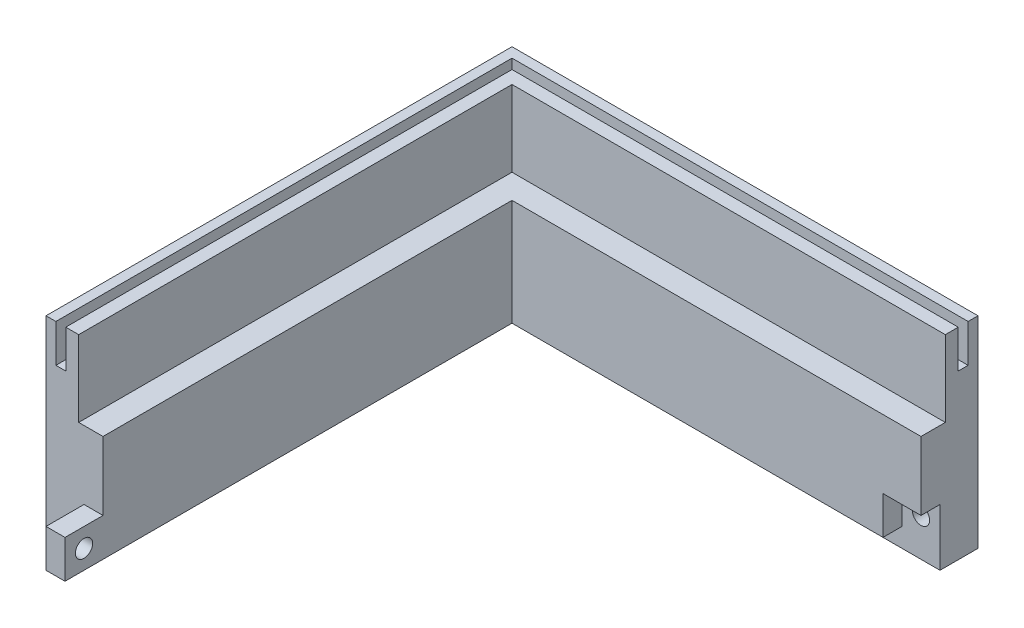
ISO-10303-21;
HEADER;
FILE_DESCRIPTION(('STEP AP214'),'2;1');
FILE_NAME('part.step','',(''),(''),'','','');
FILE_SCHEMA(('AUTOMOTIVE_DESIGN { 1 0 10303 214 1 1 1 1 }'));
ENDSEC;
DATA;
#1=APPLICATION_CONTEXT('core data for automotive mechanical design processes');
#2=APPLICATION_PROTOCOL_DEFINITION('international standard','automotive_design',2000,#1);
#3=PRODUCT_CONTEXT('',#1,'mechanical');
#4=PRODUCT('Part','Part','',(#3));
#5=PRODUCT_RELATED_PRODUCT_CATEGORY('part','',(#4));
#6=PRODUCT_DEFINITION_FORMATION('','',#4);
#7=PRODUCT_DEFINITION_CONTEXT('part definition',#1,'design');
#8=PRODUCT_DEFINITION('design','',#6,#7);
#9=PRODUCT_DEFINITION_SHAPE('','',#8);
#10=(LENGTH_UNIT() NAMED_UNIT(*) SI_UNIT(.MILLI.,.METRE.));
#11=(NAMED_UNIT(*) PLANE_ANGLE_UNIT() SI_UNIT($,.RADIAN.));
#12=(NAMED_UNIT(*) SI_UNIT($,.STERADIAN.) SOLID_ANGLE_UNIT());
#13=UNCERTAINTY_MEASURE_WITH_UNIT(LENGTH_MEASURE(1.E-05),#10,'distance_accuracy_value','');
#14=(GEOMETRIC_REPRESENTATION_CONTEXT(3) GLOBAL_UNCERTAINTY_ASSIGNED_CONTEXT((#13)) GLOBAL_UNIT_ASSIGNED_CONTEXT((#10,
#11,#12)) REPRESENTATION_CONTEXT('',''));
#15=CARTESIAN_POINT('',(0.,0.,0.));
#16=DIRECTION('',(0.,0.,1.));
#17=DIRECTION('',(1.,0.,0.));
#18=AXIS2_PLACEMENT_3D('',#15,#16,#17);
#19=CARTESIAN_POINT('',(0.,6.35,0.));
#20=DIRECTION('',(0.,-1.,0.));
#21=DIRECTION('',(0.,0.,-1.));
#22=AXIS2_PLACEMENT_3D('',#19,#20,#21);
#23=PLANE('',#22);
#24=CARTESIAN_POINT('',(-44.7306055991896,6.35,-21.7885049718995));
#25=DIRECTION('',(0.,-1.,0.));
#26=DIRECTION('',(0.,0.,-1.));
#27=AXIS2_PLACEMENT_3D('',#24,#25,#26);
#28=CIRCLE('',#27,2.8829);
#29=CARTESIAN_POINT('',(-44.7306055991896,6.35,-24.6714049718995));
#30=VERTEX_POINT('',#29);
#31=EDGE_CURVE('E497',#30,#30,#28,.T.);
#32=ORIENTED_EDGE('',*,*,#31,.F.);
#33=EDGE_LOOP('',(#32));
#34=FACE_BOUND('',#33,.T.);
#35=DIRECTION('',(1.,0.,0.));
#36=VECTOR('',#35,1.);
#37=CARTESIAN_POINT('',(-47.9056055991895,6.35,-24.9635049718995));
#38=LINE('',#37,#36);
#39=CARTESIAN_POINT('',(-47.9056055991895,6.35,-24.9635049718995));
#40=VERTEX_POINT('',#39);
#41=CARTESIAN_POINT('',(82.3963944008104,6.35,-24.9635049718995));
#42=VERTEX_POINT('',#41);
#43=EDGE_CURVE('E249',#40,#42,#38,.T.);
#44=ORIENTED_EDGE('',*,*,#43,.T.);
#45=DIRECTION('',(0.,0.,-1.));
#46=VECTOR('',#45,1.);
#47=CARTESIAN_POINT('',(82.3963944008104,6.35,-24.9635049718995));
#48=LINE('',#47,#46);
#49=CARTESIAN_POINT('',(82.3963944008104,6.35,-18.6135049718995));
#50=VERTEX_POINT('',#49);
#51=EDGE_CURVE('E201',#50,#42,#48,.T.);
#52=ORIENTED_EDGE('',*,*,#51,.F.);
#53=DIRECTION('',(-1.,0.,0.));
#54=VECTOR('',#53,1.);
#55=CARTESIAN_POINT('',(95.0963944008104,6.35,-18.6135049718995));
#56=LINE('',#55,#54);
#57=CARTESIAN_POINT('',(-41.5556055991896,6.35,-18.6135049718995));
#58=VERTEX_POINT('',#57);
#59=EDGE_CURVE('E251',#50,#58,#56,.T.);
#60=ORIENTED_EDGE('',*,*,#59,.T.);
#61=DIRECTION('',(0.,0.,1.));
#62=VECTOR('',#61,1.);
#63=CARTESIAN_POINT('',(-41.5556055991896,6.35,-18.6135049718995));
#64=LINE('',#63,#62);
#65=CARTESIAN_POINT('',(-41.5556055991896,6.35,130.738495028101));
#66=VERTEX_POINT('',#65);
#67=EDGE_CURVE('E243',#58,#66,#64,.T.);
#68=ORIENTED_EDGE('',*,*,#67,.T.);
#69=DIRECTION('',(1.,0.,0.));
#70=VECTOR('',#69,1.);
#71=CARTESIAN_POINT('',(-47.9056055991896,6.35,130.738495028101));
#72=LINE('',#71,#70);
#73=CARTESIAN_POINT('',(-47.9056055991896,6.35,130.738495028101));
#74=VERTEX_POINT('',#73);
#75=EDGE_CURVE('E223',#74,#66,#72,.T.);
#76=ORIENTED_EDGE('',*,*,#75,.F.);
#77=DIRECTION('',(0.,0.,-1.));
#78=VECTOR('',#77,1.);
#79=CARTESIAN_POINT('',(-47.9056055991896,6.35,130.738495028101));
#80=LINE('',#79,#78);
#81=CARTESIAN_POINT('',(-47.9056055991896,6.35,118.0384950281));
#82=VERTEX_POINT('',#81);
#83=EDGE_CURVE('E239',#74,#82,#80,.T.);
#84=ORIENTED_EDGE('',*,*,#83,.T.);
#85=DIRECTION('',(0.,0.,-1.));
#86=VECTOR('',#85,1.);
#87=CARTESIAN_POINT('',(-47.9056055991896,6.35,118.0384950281));
#88=LINE('',#87,#86);
#89=EDGE_CURVE('E245',#82,#40,#88,.T.);
#90=ORIENTED_EDGE('',*,*,#89,.T.);
#91=EDGE_LOOP('',(#44,#52,#60,#68,#76,#84,#90));
#92=FACE_BOUND('',#91,.T.);
#93=ADVANCED_FACE('F34',(#34,#92),#23,.T.);
#94=CARTESIAN_POINT('',(95.0963944008104,67.31,-18.6135049718995));
#95=DIRECTION('',(0.,0.,1.));
#96=DIRECTION('',(1.,0.,0.));
#97=AXIS2_PLACEMENT_3D('',#94,#95,#96);
#98=PLANE('',#97);
#99=DIRECTION('',(1.,0.,0.));
#100=VECTOR('',#99,1.);
#101=CARTESIAN_POINT('',(82.3963944008104,19.05,-18.6135049718995));
#102=LINE('',#101,#100);
#103=CARTESIAN_POINT('',(82.3963944008104,19.05,-18.6135049718995));
#104=VERTEX_POINT('',#103);
#105=CARTESIAN_POINT('',(95.0963944008104,19.05,-18.6135049718995));
#106=VERTEX_POINT('',#105);
#107=EDGE_CURVE('E200',#104,#106,#102,.T.);
#108=ORIENTED_EDGE('',*,*,#107,.T.);
#109=DIRECTION('',(0.,-1.,0.));
#110=VECTOR('',#109,1.);
#111=CARTESIAN_POINT('',(95.0963944008104,67.31,-18.6135049718995));
#112=LINE('',#111,#110);
#113=CARTESIAN_POINT('',(95.0963944008104,41.91,-18.6135049718995));
#114=VERTEX_POINT('',#113);
#115=EDGE_CURVE('E11',#114,#106,#112,.T.);
#116=ORIENTED_EDGE('',*,*,#115,.F.);
#117=DIRECTION('',(1.,0.,0.));
#118=VECTOR('',#117,1.);
#119=CARTESIAN_POINT('',(95.0963944008104,41.91,-18.6135049718995));
#120=LINE('',#119,#118);
#121=CARTESIAN_POINT('',(-41.5556055991896,41.91,-18.6135049718995));
#122=VERTEX_POINT('',#121);
#123=EDGE_CURVE('E267',#122,#114,#120,.T.);
#124=ORIENTED_EDGE('',*,*,#123,.F.);
#125=DIRECTION('',(0.,-1.,0.));
#126=VECTOR('',#125,1.);
#127=CARTESIAN_POINT('',(-41.5556055991896,67.31,-18.6135049718995));
#128=LINE('',#127,#126);
#129=EDGE_CURVE('E345',#122,#58,#128,.T.);
#130=ORIENTED_EDGE('',*,*,#129,.T.);
#131=ORIENTED_EDGE('',*,*,#59,.F.);
#132=DIRECTION('',(0.,-1.,0.));
#133=VECTOR('',#132,1.);
#134=CARTESIAN_POINT('',(82.3963944008104,6.35,-18.6135049718995));
#135=LINE('',#134,#133);
#136=EDGE_CURVE('E51',#104,#50,#135,.T.);
#137=ORIENTED_EDGE('',*,*,#136,.F.);
#138=EDGE_LOOP('',(#108,#116,#124,#130,#131,#137));
#139=FACE_BOUND('',#138,.T.);
#140=ADVANCED_FACE('F36',(#139),#98,.T.);
#141=CARTESIAN_POINT('',(-41.5556055991896,67.31,-18.6135049718995));
#142=DIRECTION('',(1.,0.,0.));
#143=DIRECTION('',(0.,0.,-1.));
#144=AXIS2_PLACEMENT_3D('',#141,#142,#143);
#145=PLANE('',#144);
#146=CARTESIAN_POINT('',(-41.5556055991896,12.7,124.388495028101));
#147=DIRECTION('',(1.,0.,0.));
#148=DIRECTION('',(0.,0.,-1.));
#149=AXIS2_PLACEMENT_3D('',#146,#147,#148);
#150=CIRCLE('',#149,2.88289999999999);
#151=CARTESIAN_POINT('',(-41.5556055991896,12.7,121.505595028101));
#152=VERTEX_POINT('',#151);
#153=EDGE_CURVE('E213',#152,#152,#150,.T.);
#154=ORIENTED_EDGE('',*,*,#153,.F.);
#155=EDGE_LOOP('',(#154));
#156=FACE_BOUND('',#155,.T.);
#157=DIRECTION('',(0.,-1.,0.));
#158=VECTOR('',#157,1.);
#159=CARTESIAN_POINT('',(-41.5556055991896,67.31,118.0384950281));
#160=LINE('',#159,#158);
#161=CARTESIAN_POINT('',(-41.5556055991896,41.91,118.0384950281));
#162=VERTEX_POINT('',#161);
#163=CARTESIAN_POINT('',(-41.5556055991896,19.05,118.0384950281));
#164=VERTEX_POINT('',#163);
#165=EDGE_CURVE('E362',#162,#164,#160,.T.);
#166=ORIENTED_EDGE('',*,*,#165,.T.);
#167=DIRECTION('',(0.,0.,-1.));
#168=VECTOR('',#167,1.);
#169=CARTESIAN_POINT('',(-41.5556055991896,19.05,130.738495028101));
#170=LINE('',#169,#168);
#171=CARTESIAN_POINT('',(-41.5556055991896,19.05,130.738495028101));
#172=VERTEX_POINT('',#171);
#173=EDGE_CURVE('E236',#172,#164,#170,.T.);
#174=ORIENTED_EDGE('',*,*,#173,.F.);
#175=DIRECTION('',(0.,1.,0.));
#176=VECTOR('',#175,1.);
#177=CARTESIAN_POINT('',(-41.5556055991896,6.35,130.738495028101));
#178=LINE('',#177,#176);
#179=EDGE_CURVE('E226',#66,#172,#178,.T.);
#180=ORIENTED_EDGE('',*,*,#179,.F.);
#181=ORIENTED_EDGE('',*,*,#67,.F.);
#182=ORIENTED_EDGE('',*,*,#129,.F.);
#183=DIRECTION('',(0.,0.,-1.));
#184=VECTOR('',#183,1.);
#185=CARTESIAN_POINT('',(-41.5556055991896,41.91,-18.6135049718995));
#186=LINE('',#185,#184);
#187=EDGE_CURVE('E264',#162,#122,#186,.T.);
#188=ORIENTED_EDGE('',*,*,#187,.F.);
#189=EDGE_LOOP('',(#166,#174,#180,#181,#182,#188));
#190=FACE_BOUND('',#189,.T.);
#191=ADVANCED_FACE('F372',(#156,#190),#145,.T.);
#192=CARTESIAN_POINT('',(0.,67.31,0.));
#193=DIRECTION('',(0.,1.,0.));
#194=DIRECTION('',(0.,0.,1.));
#195=AXIS2_PLACEMENT_3D('',#192,#193,#194);
#196=PLANE('',#195);
#197=DIRECTION('',(0.,0.,1.));
#198=VECTOR('',#197,1.);
#199=CARTESIAN_POINT('',(-57.3036055991896,67.31,118.0384950281));
#200=LINE('',#199,#198);
#201=CARTESIAN_POINT('',(-57.3036055991896,67.31,-34.3615049718995));
#202=VERTEX_POINT('',#201);
#203=CARTESIAN_POINT('',(-57.3036055991896,67.31,118.0384950281));
#204=VERTEX_POINT('',#203);
#205=EDGE_CURVE('E293',#202,#204,#200,.T.);
#206=ORIENTED_EDGE('',*,*,#205,.F.);
#207=DIRECTION('',(-1.,0.,0.));
#208=VECTOR('',#207,1.);
#209=CARTESIAN_POINT('',(-57.3036055991896,67.31,-34.3615049718995));
#210=LINE('',#209,#208);
#211=CARTESIAN_POINT('',(95.0963944008104,67.31,-34.3615049718995));
#212=VERTEX_POINT('',#211);
#213=EDGE_CURVE('E313',#212,#202,#210,.T.);
#214=ORIENTED_EDGE('',*,*,#213,.F.);
#215=DIRECTION('',(0.,0.,1.));
#216=VECTOR('',#215,1.);
#217=CARTESIAN_POINT('',(95.0963944008104,67.31,-37.6635049718995));
#218=LINE('',#217,#216);
#219=CARTESIAN_POINT('',(95.0963944008104,67.31,-37.6635049718995));
#220=VERTEX_POINT('',#219);
#221=EDGE_CURVE('E342',#220,#212,#218,.T.);
#222=ORIENTED_EDGE('',*,*,#221,.F.);
#223=DIRECTION('',(1.,0.,0.));
#224=VECTOR('',#223,1.);
#225=CARTESIAN_POINT('',(-60.6056055991896,67.31,-37.6635049718995));
#226=LINE('',#225,#224);
#227=CARTESIAN_POINT('',(-60.6056055991896,67.31,-37.6635049718995));
#228=VERTEX_POINT('',#227);
#229=EDGE_CURVE('E338',#228,#220,#226,.T.);
#230=ORIENTED_EDGE('',*,*,#229,.F.);
#231=DIRECTION('',(0.,0.,-1.));
#232=VECTOR('',#231,1.);
#233=CARTESIAN_POINT('',(-60.6056055991896,67.31,118.0384950281));
#234=LINE('',#233,#232);
#235=CARTESIAN_POINT('',(-60.6056055991896,67.31,118.0384950281));
#236=VERTEX_POINT('',#235);
#237=EDGE_CURVE('E334',#236,#228,#234,.T.);
#238=ORIENTED_EDGE('',*,*,#237,.F.);
#239=DIRECTION('',(-1.,0.,0.));
#240=VECTOR('',#239,1.);
#241=CARTESIAN_POINT('',(-41.5556055991896,67.31,118.0384950281));
#242=LINE('',#241,#240);
#243=EDGE_CURVE('E335',#204,#236,#242,.T.);
#244=ORIENTED_EDGE('',*,*,#243,.F.);
#245=EDGE_LOOP('',(#206,#214,#222,#230,#238,#244));
#246=FACE_BOUND('',#245,.T.);
#247=ADVANCED_FACE('F464',(#246),#196,.T.);
#248=CARTESIAN_POINT('',(95.0963944008104,67.31,-37.6635049718995));
#249=DIRECTION('',(1.,0.,0.));
#250=DIRECTION('',(0.,0.,-1.));
#251=AXIS2_PLACEMENT_3D('',#248,#249,#250);
#252=PLANE('',#251);
#253=DIRECTION('',(0.,0.,1.));
#254=VECTOR('',#253,1.);
#255=CARTESIAN_POINT('',(95.0963944008104,19.05,-24.9635049718995));
#256=LINE('',#255,#254);
#257=CARTESIAN_POINT('',(95.0963944008104,19.05,-24.9635049718995));
#258=VERTEX_POINT('',#257);
#259=EDGE_CURVE('E209',#258,#106,#256,.T.);
#260=ORIENTED_EDGE('',*,*,#259,.F.);
#261=DIRECTION('',(0.,-1.,0.));
#262=VECTOR('',#261,1.);
#263=CARTESIAN_POINT('',(95.0963944008104,6.35,-24.9635049718995));
#264=LINE('',#263,#262);
#265=CARTESIAN_POINT('',(95.0963944008104,0.,-24.9635049718995));
#266=VERTEX_POINT('',#265);
#267=EDGE_CURVE('E197',#258,#266,#264,.T.);
#268=ORIENTED_EDGE('',*,*,#267,.T.);
#269=DIRECTION('',(0.,0.,1.));
#270=VECTOR('',#269,1.);
#271=CARTESIAN_POINT('',(95.0963944008104,0.,-37.6635049718995));
#272=LINE('',#271,#270);
#273=CARTESIAN_POINT('',(95.0963944008104,0.,-37.6635049718995));
#274=VERTEX_POINT('',#273);
#275=EDGE_CURVE('E353',#274,#266,#272,.T.);
#276=ORIENTED_EDGE('',*,*,#275,.F.);
#277=DIRECTION('',(0.,-1.,0.));
#278=VECTOR('',#277,1.);
#279=CARTESIAN_POINT('',(95.0963944008104,67.31,-37.6635049718995));
#280=LINE('',#279,#278);
#281=EDGE_CURVE('E43',#220,#274,#280,.T.);
#282=ORIENTED_EDGE('',*,*,#281,.F.);
#283=ORIENTED_EDGE('',*,*,#221,.T.);
#284=DIRECTION('',(0.,1.,0.));
#285=VECTOR('',#284,1.);
#286=CARTESIAN_POINT('',(95.0963944008104,54.6166591658951,-34.3615049718995));
#287=LINE('',#286,#285);
#288=CARTESIAN_POINT('',(95.0963944008104,54.6166591658951,-34.3615049718995));
#289=VERTEX_POINT('',#288);
#290=EDGE_CURVE('E323',#289,#212,#287,.T.);
#291=ORIENTED_EDGE('',*,*,#290,.F.);
#292=DIRECTION('',(0.,0.,-1.));
#293=VECTOR('',#292,1.);
#294=CARTESIAN_POINT('',(95.0963944008104,54.6166591658951,-34.3615049718995));
#295=LINE('',#294,#293);
#296=CARTESIAN_POINT('',(95.0963944008104,54.6166591658951,-31.0595049718995));
#297=VERTEX_POINT('',#296);
#298=EDGE_CURVE('E299',#297,#289,#295,.T.);
#299=ORIENTED_EDGE('',*,*,#298,.F.);
#300=DIRECTION('',(0.,1.,0.));
#301=VECTOR('',#300,1.);
#302=CARTESIAN_POINT('',(95.0963944008104,54.6166591658951,-31.0595049718995));
#303=LINE('',#302,#301);
#304=CARTESIAN_POINT('',(95.0963944008104,67.31,-31.0595049718995));
#305=VERTEX_POINT('',#304);
#306=EDGE_CURVE('E325',#297,#305,#303,.T.);
#307=ORIENTED_EDGE('',*,*,#306,.T.);
#308=CARTESIAN_POINT('',(95.0963944008104,67.31,-26.7415049718995));
#309=VERTEX_POINT('',#308);
#310=EDGE_CURVE('E341',#305,#309,#218,.T.);
#311=ORIENTED_EDGE('',*,*,#310,.T.);
#312=DIRECTION('',(0.,1.,0.));
#313=VECTOR('',#312,1.);
#314=CARTESIAN_POINT('',(95.0963944008104,41.91,-26.7415049718995));
#315=LINE('',#314,#313);
#316=CARTESIAN_POINT('',(95.0963944008104,41.91,-26.7415049718995));
#317=VERTEX_POINT('',#316);
#318=EDGE_CURVE('E278',#317,#309,#315,.T.);
#319=ORIENTED_EDGE('',*,*,#318,.F.);
#320=DIRECTION('',(0.,0.,-1.));
#321=VECTOR('',#320,1.);
#322=CARTESIAN_POINT('',(95.0963944008104,41.91,-26.7415049718995));
#323=LINE('',#322,#321);
#324=EDGE_CURVE('E269',#114,#317,#323,.T.);
#325=ORIENTED_EDGE('',*,*,#324,.F.);
#326=ORIENTED_EDGE('',*,*,#115,.T.);
#327=EDGE_LOOP('',(#260,#268,#276,#282,#283,#291,#299,#307,#311,#319,#325,#326));
#328=FACE_BOUND('',#327,.T.);
#329=ADVANCED_FACE('F397',(#328),#252,.T.);
#330=CARTESIAN_POINT('',(-60.6056055991896,67.31,-37.6635049718995));
#331=DIRECTION('',(0.,0.,-1.));
#332=DIRECTION('',(-1.,0.,0.));
#333=AXIS2_PLACEMENT_3D('',#330,#331,#332);
#334=PLANE('',#333);
#335=DIRECTION('',(1.,0.,0.));
#336=VECTOR('',#335,1.);
#337=CARTESIAN_POINT('',(-60.6056055991896,0.,-37.6635049718995));
#338=LINE('',#337,#336);
#339=CARTESIAN_POINT('',(-60.6056055991896,0.,-37.6635049718995));
#340=VERTEX_POINT('',#339);
#341=EDGE_CURVE('E350',#340,#274,#338,.T.);
#342=ORIENTED_EDGE('',*,*,#341,.F.);
#343=DIRECTION('',(0.,-1.,0.));
#344=VECTOR('',#343,1.);
#345=CARTESIAN_POINT('',(-60.6056055991896,67.31,-37.6635049718995));
#346=LINE('',#345,#344);
#347=EDGE_CURVE('E357',#228,#340,#346,.T.);
#348=ORIENTED_EDGE('',*,*,#347,.F.);
#349=ORIENTED_EDGE('',*,*,#229,.T.);
#350=ORIENTED_EDGE('',*,*,#281,.T.);
#351=EDGE_LOOP('',(#342,#348,#349,#350));
#352=FACE_BOUND('',#351,.T.);
#353=ADVANCED_FACE('F469',(#352),#334,.T.);
#354=CARTESIAN_POINT('',(-60.6056055991896,67.31,118.0384950281));
#355=DIRECTION('',(-1.,0.,0.));
#356=DIRECTION('',(0.,0.,1.));
#357=AXIS2_PLACEMENT_3D('',#354,#355,#356);
#358=PLANE('',#357);
#359=DIRECTION('',(0.,0.,-1.));
#360=VECTOR('',#359,1.);
#361=CARTESIAN_POINT('',(-60.6056055991896,0.,118.0384950281));
#362=LINE('',#361,#360);
#363=CARTESIAN_POINT('',(-60.6056055991896,0.,118.0384950281));
#364=VERTEX_POINT('',#363);
#365=EDGE_CURVE('E347',#364,#340,#362,.T.);
#366=ORIENTED_EDGE('',*,*,#365,.F.);
#367=DIRECTION('',(0.,-1.,0.));
#368=VECTOR('',#367,1.);
#369=CARTESIAN_POINT('',(-60.6056055991896,67.31,118.0384950281));
#370=LINE('',#369,#368);
#371=EDGE_CURVE('E359',#236,#364,#370,.T.);
#372=ORIENTED_EDGE('',*,*,#371,.F.);
#373=ORIENTED_EDGE('',*,*,#237,.T.);
#374=ORIENTED_EDGE('',*,*,#347,.T.);
#375=EDGE_LOOP('',(#366,#372,#373,#374));
#376=FACE_BOUND('',#375,.T.);
#377=ADVANCED_FACE('F472',(#376),#358,.T.);
#378=CARTESIAN_POINT('',(-41.5556055991896,67.31,118.0384950281));
#379=DIRECTION('',(0.,0.,1.));
#380=DIRECTION('',(1.,0.,0.));
#381=AXIS2_PLACEMENT_3D('',#378,#379,#380);
#382=PLANE('',#381);
#383=DIRECTION('',(0.,-1.,0.));
#384=VECTOR('',#383,1.);
#385=CARTESIAN_POINT('',(-47.9056055991896,6.35,118.0384950281));
#386=LINE('',#385,#384);
#387=CARTESIAN_POINT('',(-47.9056055991896,19.05,118.0384950281));
#388=VERTEX_POINT('',#387);
#389=EDGE_CURVE('E218',#388,#82,#386,.T.);
#390=ORIENTED_EDGE('',*,*,#389,.F.);
#391=DIRECTION('',(-1.,0.,0.));
#392=VECTOR('',#391,1.);
#393=CARTESIAN_POINT('',(-47.9056055991896,19.05,118.0384950281));
#394=LINE('',#393,#392);
#395=EDGE_CURVE('E59',#164,#388,#394,.T.);
#396=ORIENTED_EDGE('',*,*,#395,.F.);
#397=ORIENTED_EDGE('',*,*,#165,.F.);
#398=DIRECTION('',(1.,0.,0.));
#399=VECTOR('',#398,1.);
#400=CARTESIAN_POINT('',(-41.5556055991896,41.91,118.0384950281));
#401=LINE('',#400,#399);
#402=CARTESIAN_POINT('',(-49.6836055991896,41.91,118.0384950281));
#403=VERTEX_POINT('',#402);
#404=EDGE_CURVE('E262',#403,#162,#401,.T.);
#405=ORIENTED_EDGE('',*,*,#404,.F.);
#406=DIRECTION('',(0.,1.,0.));
#407=VECTOR('',#406,1.);
#408=CARTESIAN_POINT('',(-49.6836055991896,41.91,118.0384950281));
#409=LINE('',#408,#407);
#410=CARTESIAN_POINT('',(-49.6836055991896,67.31,118.0384950281));
#411=VERTEX_POINT('',#410);
#412=EDGE_CURVE('E282',#403,#411,#409,.T.);
#413=ORIENTED_EDGE('',*,*,#412,.T.);
#414=CARTESIAN_POINT('',(-54.0016055991896,67.31,118.0384950281));
#415=VERTEX_POINT('',#414);
#416=EDGE_CURVE('E332',#411,#415,#242,.T.);
#417=ORIENTED_EDGE('',*,*,#416,.T.);
#418=DIRECTION('',(0.,1.,0.));
#419=VECTOR('',#418,1.);
#420=CARTESIAN_POINT('',(-54.0016055991896,54.6166591658951,118.038495028101));
#421=LINE('',#420,#419);
#422=CARTESIAN_POINT('',(-54.0016055991896,54.6166591658951,118.038495028101));
#423=VERTEX_POINT('',#422);
#424=EDGE_CURVE('E308',#423,#415,#421,.T.);
#425=ORIENTED_EDGE('',*,*,#424,.F.);
#426=DIRECTION('',(1.,0.,0.));
#427=VECTOR('',#426,1.);
#428=CARTESIAN_POINT('',(-57.3036055991896,54.6166591658951,118.0384950281));
#429=LINE('',#428,#427);
#430=CARTESIAN_POINT('',(-57.3036055991896,54.6166591658951,118.0384950281));
#431=VERTEX_POINT('',#430);
#432=EDGE_CURVE('E289',#431,#423,#429,.T.);
#433=ORIENTED_EDGE('',*,*,#432,.F.);
#434=DIRECTION('',(0.,1.,0.));
#435=VECTOR('',#434,1.);
#436=CARTESIAN_POINT('',(-57.3036055991896,54.6166591658951,118.0384950281));
#437=LINE('',#436,#435);
#438=EDGE_CURVE('E317',#431,#204,#437,.T.);
#439=ORIENTED_EDGE('',*,*,#438,.T.);
#440=ORIENTED_EDGE('',*,*,#243,.T.);
#441=ORIENTED_EDGE('',*,*,#371,.T.);
#442=DIRECTION('',(-1.,0.,0.));
#443=VECTOR('',#442,1.);
#444=CARTESIAN_POINT('',(-41.5556055991896,0.,118.0384950281));
#445=LINE('',#444,#443);
#446=CARTESIAN_POINT('',(-47.9056055991896,0.,118.0384950281));
#447=VERTEX_POINT('',#446);
#448=EDGE_CURVE('E320',#447,#364,#445,.T.);
#449=ORIENTED_EDGE('',*,*,#448,.F.);
#450=DIRECTION('',(0.,-1.,0.));
#451=VECTOR('',#450,1.);
#452=CARTESIAN_POINT('',(-47.9056055991896,6.35,118.0384950281));
#453=LINE('',#452,#451);
#454=EDGE_CURVE('E253',#82,#447,#453,.T.);
#455=ORIENTED_EDGE('',*,*,#454,.F.);
#456=EDGE_LOOP('',(#390,#396,#397,#405,#413,#417,#425,#433,#439,#440,#441,#449,#455));
#457=FACE_BOUND('',#456,.T.);
#458=ADVANCED_FACE('F389',(#457),#382,.T.);
#459=DIRECTION('',(0.,0.,1.));
#460=VECTOR('',#459,1.);
#461=CARTESIAN_POINT('',(-49.6836055991896,67.31,118.0384950281));
#462=LINE('',#461,#460);
#463=CARTESIAN_POINT('',(-49.6836055991896,67.31,-26.7415049718995));
#464=VERTEX_POINT('',#463);
#465=EDGE_CURVE('E265',#464,#411,#462,.T.);
#466=ORIENTED_EDGE('',*,*,#465,.F.);
#467=DIRECTION('',(-1.,0.,0.));
#468=VECTOR('',#467,1.);
#469=CARTESIAN_POINT('',(-49.6836055991896,67.31,-26.7415049718995));
#470=LINE('',#469,#468);
#471=EDGE_CURVE('E258',#309,#464,#470,.T.);
#472=ORIENTED_EDGE('',*,*,#471,.F.);
#473=ORIENTED_EDGE('',*,*,#310,.F.);
#474=DIRECTION('',(1.,0.,0.));
#475=VECTOR('',#474,1.);
#476=CARTESIAN_POINT('',(-54.0016055991896,67.31,-31.0595049718995));
#477=LINE('',#476,#475);
#478=CARTESIAN_POINT('',(-54.0016055991896,67.31,-31.0595049718995));
#479=VERTEX_POINT('',#478);
#480=EDGE_CURVE('E311',#479,#305,#477,.T.);
#481=ORIENTED_EDGE('',*,*,#480,.F.);
#482=DIRECTION('',(0.,0.,-1.));
#483=VECTOR('',#482,1.);
#484=CARTESIAN_POINT('',(-54.0016055991896,67.31,118.038495028101));
#485=LINE('',#484,#483);
#486=EDGE_CURVE('E285',#415,#479,#485,.T.);
#487=ORIENTED_EDGE('',*,*,#486,.F.);
#488=ORIENTED_EDGE('',*,*,#416,.F.);
#489=EDGE_LOOP('',(#466,#472,#473,#481,#487,#488));
#490=FACE_BOUND('',#489,.T.);
#491=ADVANCED_FACE('F460',(#490),#196,.T.);
#492=CARTESIAN_POINT('',(0.,0.,0.));
#493=DIRECTION('',(0.,1.,0.));
#494=DIRECTION('',(0.,0.,1.));
#495=AXIS2_PLACEMENT_3D('',#492,#493,#494);
#496=PLANE('',#495);
#497=ORIENTED_EDGE('',*,*,#275,.T.);
#498=DIRECTION('',(1.,0.,0.));
#499=VECTOR('',#498,1.);
#500=CARTESIAN_POINT('',(-47.9056055991895,0.,-24.9635049718995));
#501=LINE('',#500,#499);
#502=CARTESIAN_POINT('',(-47.9056055991895,0.,-24.9635049718995));
#503=VERTEX_POINT('',#502);
#504=EDGE_CURVE('E246',#503,#266,#501,.T.);
#505=ORIENTED_EDGE('',*,*,#504,.F.);
#506=DIRECTION('',(0.,0.,-1.));
#507=VECTOR('',#506,1.);
#508=CARTESIAN_POINT('',(-47.9056055991896,0.,118.0384950281));
#509=LINE('',#508,#507);
#510=EDGE_CURVE('E242',#447,#503,#509,.T.);
#511=ORIENTED_EDGE('',*,*,#510,.F.);
#512=ORIENTED_EDGE('',*,*,#448,.T.);
#513=ORIENTED_EDGE('',*,*,#365,.T.);
#514=ORIENTED_EDGE('',*,*,#341,.T.);
#515=EDGE_LOOP('',(#497,#505,#511,#512,#513,#514));
#516=FACE_BOUND('',#515,.T.);
#517=ADVANCED_FACE('F393',(#516),#496,.F.);
#518=CARTESIAN_POINT('',(-57.3036055991896,54.6166591658951,118.0384950281));
#519=DIRECTION('',(-1.,0.,0.));
#520=DIRECTION('',(0.,0.,1.));
#521=AXIS2_PLACEMENT_3D('',#518,#519,#520);
#522=PLANE('',#521);
#523=ORIENTED_EDGE('',*,*,#205,.T.);
#524=ORIENTED_EDGE('',*,*,#438,.F.);
#525=DIRECTION('',(0.,0.,1.));
#526=VECTOR('',#525,1.);
#527=CARTESIAN_POINT('',(-57.3036055991896,54.6166591658951,118.0384950281));
#528=LINE('',#527,#526);
#529=CARTESIAN_POINT('',(-57.3036055991896,54.6166591658951,-34.3615049718995));
#530=VERTEX_POINT('',#529);
#531=EDGE_CURVE('E305',#530,#431,#528,.T.);
#532=ORIENTED_EDGE('',*,*,#531,.F.);
#533=DIRECTION('',(0.,1.,0.));
#534=VECTOR('',#533,1.);
#535=CARTESIAN_POINT('',(-57.3036055991896,54.6166591658951,-34.3615049718995));
#536=LINE('',#535,#534);
#537=EDGE_CURVE('E321',#530,#202,#536,.T.);
#538=ORIENTED_EDGE('',*,*,#537,.T.);
#539=EDGE_LOOP('',(#523,#524,#532,#538));
#540=FACE_BOUND('',#539,.T.);
#541=ADVANCED_FACE('F445',(#540),#522,.F.);
#542=CARTESIAN_POINT('',(-57.3036055991896,54.6166591658951,-34.3615049718995));
#543=DIRECTION('',(0.,0.,-1.));
#544=DIRECTION('',(-1.,0.,0.));
#545=AXIS2_PLACEMENT_3D('',#542,#543,#544);
#546=PLANE('',#545);
#547=ORIENTED_EDGE('',*,*,#213,.T.);
#548=ORIENTED_EDGE('',*,*,#537,.F.);
#549=DIRECTION('',(-1.,0.,0.));
#550=VECTOR('',#549,1.);
#551=CARTESIAN_POINT('',(-57.3036055991896,54.6166591658951,-34.3615049718995));
#552=LINE('',#551,#550);
#553=EDGE_CURVE('E302',#289,#530,#552,.T.);
#554=ORIENTED_EDGE('',*,*,#553,.F.);
#555=ORIENTED_EDGE('',*,*,#290,.T.);
#556=EDGE_LOOP('',(#547,#548,#554,#555));
#557=FACE_BOUND('',#556,.T.);
#558=ADVANCED_FACE('F448',(#557),#546,.F.);
#559=CARTESIAN_POINT('',(-54.0016055991896,54.6166591658951,-31.0595049718995));
#560=DIRECTION('',(0.,0.,1.));
#561=DIRECTION('',(1.,0.,0.));
#562=AXIS2_PLACEMENT_3D('',#559,#560,#561);
#563=PLANE('',#562);
#564=ORIENTED_EDGE('',*,*,#480,.T.);
#565=ORIENTED_EDGE('',*,*,#306,.F.);
#566=DIRECTION('',(1.,0.,0.));
#567=VECTOR('',#566,1.);
#568=CARTESIAN_POINT('',(-54.0016055991896,54.6166591658951,-31.0595049718995));
#569=LINE('',#568,#567);
#570=CARTESIAN_POINT('',(-54.0016055991896,54.6166591658951,-31.0595049718995));
#571=VERTEX_POINT('',#570);
#572=EDGE_CURVE('E296',#571,#297,#569,.T.);
#573=ORIENTED_EDGE('',*,*,#572,.F.);
#574=DIRECTION('',(0.,1.,0.));
#575=VECTOR('',#574,1.);
#576=CARTESIAN_POINT('',(-54.0016055991896,54.6166591658951,-31.0595049718995));
#577=LINE('',#576,#575);
#578=EDGE_CURVE('E328',#571,#479,#577,.T.);
#579=ORIENTED_EDGE('',*,*,#578,.T.);
#580=EDGE_LOOP('',(#564,#565,#573,#579));
#581=FACE_BOUND('',#580,.T.);
#582=ADVANCED_FACE('F452',(#581),#563,.F.);
#583=CARTESIAN_POINT('',(-54.0016055991896,54.6166591658951,118.038495028101));
#584=DIRECTION('',(1.,0.,0.));
#585=DIRECTION('',(0.,0.,-1.));
#586=AXIS2_PLACEMENT_3D('',#583,#584,#585);
#587=PLANE('',#586);
#588=ORIENTED_EDGE('',*,*,#486,.T.);
#589=ORIENTED_EDGE('',*,*,#578,.F.);
#590=DIRECTION('',(0.,0.,-1.));
#591=VECTOR('',#590,1.);
#592=CARTESIAN_POINT('',(-54.0016055991896,54.6166591658951,118.038495028101));
#593=LINE('',#592,#591);
#594=EDGE_CURVE('E292',#423,#571,#593,.T.);
#595=ORIENTED_EDGE('',*,*,#594,.F.);
#596=ORIENTED_EDGE('',*,*,#424,.T.);
#597=EDGE_LOOP('',(#588,#589,#595,#596));
#598=FACE_BOUND('',#597,.T.);
#599=ADVANCED_FACE('F443',(#598),#587,.F.);
#600=CARTESIAN_POINT('',(0.,54.6166591658951,0.));
#601=DIRECTION('',(0.,1.,0.));
#602=DIRECTION('',(0.,0.,1.));
#603=AXIS2_PLACEMENT_3D('',#600,#601,#602);
#604=PLANE('',#603);
#605=ORIENTED_EDGE('',*,*,#432,.T.);
#606=ORIENTED_EDGE('',*,*,#594,.T.);
#607=ORIENTED_EDGE('',*,*,#572,.T.);
#608=ORIENTED_EDGE('',*,*,#298,.T.);
#609=ORIENTED_EDGE('',*,*,#553,.T.);
#610=ORIENTED_EDGE('',*,*,#531,.T.);
#611=EDGE_LOOP('',(#605,#606,#607,#608,#609,#610));
#612=FACE_BOUND('',#611,.T.);
#613=ADVANCED_FACE('F436',(#612),#604,.T.);
#614=CARTESIAN_POINT('',(-49.6836055991896,41.91,118.0384950281));
#615=DIRECTION('',(-1.,0.,0.));
#616=DIRECTION('',(0.,0.,1.));
#617=AXIS2_PLACEMENT_3D('',#614,#615,#616);
#618=PLANE('',#617);
#619=ORIENTED_EDGE('',*,*,#465,.T.);
#620=ORIENTED_EDGE('',*,*,#412,.F.);
#621=DIRECTION('',(0.,0.,1.));
#622=VECTOR('',#621,1.);
#623=CARTESIAN_POINT('',(-49.6836055991896,41.91,118.0384950281));
#624=LINE('',#623,#622);
#625=CARTESIAN_POINT('',(-49.6836055991896,41.91,-26.7415049718995));
#626=VERTEX_POINT('',#625);
#627=EDGE_CURVE('E275',#626,#403,#624,.T.);
#628=ORIENTED_EDGE('',*,*,#627,.F.);
#629=DIRECTION('',(0.,1.,0.));
#630=VECTOR('',#629,1.);
#631=CARTESIAN_POINT('',(-49.6836055991896,41.91,-26.7415049718995));
#632=LINE('',#631,#630);
#633=EDGE_CURVE('E286',#626,#464,#632,.T.);
#634=ORIENTED_EDGE('',*,*,#633,.T.);
#635=EDGE_LOOP('',(#619,#620,#628,#634));
#636=FACE_BOUND('',#635,.T.);
#637=ADVANCED_FACE('F433',(#636),#618,.F.);
#638=CARTESIAN_POINT('',(-49.6836055991896,41.91,-26.7415049718995));
#639=DIRECTION('',(0.,0.,-1.));
#640=DIRECTION('',(-1.,0.,0.));
#641=AXIS2_PLACEMENT_3D('',#638,#639,#640);
#642=PLANE('',#641);
#643=ORIENTED_EDGE('',*,*,#471,.T.);
#644=ORIENTED_EDGE('',*,*,#633,.F.);
#645=DIRECTION('',(-1.,0.,0.));
#646=VECTOR('',#645,1.);
#647=CARTESIAN_POINT('',(-49.6836055991896,41.91,-26.7415049718995));
#648=LINE('',#647,#646);
#649=EDGE_CURVE('E272',#317,#626,#648,.T.);
#650=ORIENTED_EDGE('',*,*,#649,.F.);
#651=ORIENTED_EDGE('',*,*,#318,.T.);
#652=EDGE_LOOP('',(#643,#644,#650,#651));
#653=FACE_BOUND('',#652,.T.);
#654=ADVANCED_FACE('F432',(#653),#642,.F.);
#655=CARTESIAN_POINT('',(0.,41.91,0.));
#656=DIRECTION('',(0.,-1.,0.));
#657=DIRECTION('',(0.,0.,-1.));
#658=AXIS2_PLACEMENT_3D('',#655,#656,#657);
#659=PLANE('',#658);
#660=ORIENTED_EDGE('',*,*,#404,.T.);
#661=ORIENTED_EDGE('',*,*,#187,.T.);
#662=ORIENTED_EDGE('',*,*,#123,.T.);
#663=ORIENTED_EDGE('',*,*,#324,.T.);
#664=ORIENTED_EDGE('',*,*,#649,.T.);
#665=ORIENTED_EDGE('',*,*,#627,.T.);
#666=EDGE_LOOP('',(#660,#661,#662,#663,#664,#665));
#667=FACE_BOUND('',#666,.T.);
#668=ADVANCED_FACE('F402',(#667),#659,.F.);
#669=CARTESIAN_POINT('',(-47.9056055991895,6.35,-24.9635049718995));
#670=DIRECTION('',(0.,0.,-1.));
#671=DIRECTION('',(-1.,0.,0.));
#672=AXIS2_PLACEMENT_3D('',#669,#670,#671);
#673=PLANE('',#672);
#674=CARTESIAN_POINT('',(88.7463944008104,12.7,-24.9635049718995));
#675=DIRECTION('',(0.,0.,1.));
#676=DIRECTION('',(1.,0.,0.));
#677=AXIS2_PLACEMENT_3D('',#674,#675,#676);
#678=CIRCLE('',#677,2.88289999999999);
#679=CARTESIAN_POINT('',(91.6292944008104,12.7,-24.9635049718995));
#680=VERTEX_POINT('',#679);
#681=EDGE_CURVE('E490',#680,#680,#678,.T.);
#682=ORIENTED_EDGE('',*,*,#681,.F.);
#683=EDGE_LOOP('',(#682));
#684=FACE_BOUND('',#683,.T.);
#685=ORIENTED_EDGE('',*,*,#504,.T.);
#686=ORIENTED_EDGE('',*,*,#267,.F.);
#687=DIRECTION('',(1.,0.,0.));
#688=VECTOR('',#687,1.);
#689=CARTESIAN_POINT('',(82.3963944008104,19.05,-24.9635049718995));
#690=LINE('',#689,#688);
#691=CARTESIAN_POINT('',(82.3963944008104,19.05,-24.9635049718995));
#692=VERTEX_POINT('',#691);
#693=EDGE_CURVE('E190',#692,#258,#690,.T.);
#694=ORIENTED_EDGE('',*,*,#693,.F.);
#695=DIRECTION('',(0.,1.,0.));
#696=VECTOR('',#695,1.);
#697=CARTESIAN_POINT('',(82.3963944008104,6.35,-24.9635049718995));
#698=LINE('',#697,#696);
#699=EDGE_CURVE('E195',#42,#692,#698,.T.);
#700=ORIENTED_EDGE('',*,*,#699,.F.);
#701=ORIENTED_EDGE('',*,*,#43,.F.);
#702=DIRECTION('',(0.,-1.,0.));
#703=VECTOR('',#702,1.);
#704=CARTESIAN_POINT('',(-47.9056055991895,6.35,-24.9635049718995));
#705=LINE('',#704,#703);
#706=EDGE_CURVE('E259',#40,#503,#705,.T.);
#707=ORIENTED_EDGE('',*,*,#706,.T.);
#708=EDGE_LOOP('',(#685,#686,#694,#700,#701,#707));
#709=FACE_BOUND('',#708,.T.);
#710=ADVANCED_FACE('F192',(#684,#709),#673,.F.);
#711=CARTESIAN_POINT('',(-47.9056055991896,6.35,118.0384950281));
#712=DIRECTION('',(-1.,0.,0.));
#713=DIRECTION('',(0.,0.,1.));
#714=AXIS2_PLACEMENT_3D('',#711,#712,#713);
#715=PLANE('',#714);
#716=ORIENTED_EDGE('',*,*,#510,.T.);
#717=ORIENTED_EDGE('',*,*,#706,.F.);
#718=ORIENTED_EDGE('',*,*,#89,.F.);
#719=ORIENTED_EDGE('',*,*,#454,.T.);
#720=EDGE_LOOP('',(#716,#717,#718,#719));
#721=FACE_BOUND('',#720,.T.);
#722=ADVANCED_FACE('F386',(#721),#715,.F.);
#723=CARTESIAN_POINT('',(-47.9056055991896,6.35,130.738495028101));
#724=DIRECTION('',(1.,0.,0.));
#725=DIRECTION('',(0.,0.,-1.));
#726=AXIS2_PLACEMENT_3D('',#723,#724,#725);
#727=PLANE('',#726);
#728=CARTESIAN_POINT('',(-47.9056055991896,12.7,124.388495028101));
#729=DIRECTION('',(1.,0.,0.));
#730=DIRECTION('',(0.,0.,-1.));
#731=AXIS2_PLACEMENT_3D('',#728,#729,#730);
#732=CIRCLE('',#731,2.88289999999999);
#733=CARTESIAN_POINT('',(-47.9056055991896,12.7,121.505595028101));
#734=VERTEX_POINT('',#733);
#735=EDGE_CURVE('E38',#734,#734,#732,.T.);
#736=ORIENTED_EDGE('',*,*,#735,.T.);
#737=EDGE_LOOP('',(#736));
#738=FACE_BOUND('',#737,.T.);
#739=ORIENTED_EDGE('',*,*,#389,.T.);
#740=ORIENTED_EDGE('',*,*,#83,.F.);
#741=DIRECTION('',(0.,-1.,0.));
#742=VECTOR('',#741,1.);
#743=CARTESIAN_POINT('',(-47.9056055991896,6.35,130.738495028101));
#744=LINE('',#743,#742);
#745=CARTESIAN_POINT('',(-47.9056055991896,19.05,130.738495028101));
#746=VERTEX_POINT('',#745);
#747=EDGE_CURVE('E220',#746,#74,#744,.T.);
#748=ORIENTED_EDGE('',*,*,#747,.F.);
#749=DIRECTION('',(0.,0.,-1.));
#750=VECTOR('',#749,1.);
#751=CARTESIAN_POINT('',(-47.9056055991896,19.05,130.738495028101));
#752=LINE('',#751,#750);
#753=EDGE_CURVE('E230',#746,#388,#752,.T.);
#754=ORIENTED_EDGE('',*,*,#753,.T.);
#755=EDGE_LOOP('',(#739,#740,#748,#754));
#756=FACE_BOUND('',#755,.T.);
#757=ADVANCED_FACE('F383',(#738,#756),#727,.F.);
#758=CARTESIAN_POINT('',(-47.9056055991896,19.05,130.738495028101));
#759=DIRECTION('',(0.,-1.,0.));
#760=DIRECTION('',(0.,0.,-1.));
#761=AXIS2_PLACEMENT_3D('',#758,#759,#760);
#762=PLANE('',#761);
#763=ORIENTED_EDGE('',*,*,#395,.T.);
#764=ORIENTED_EDGE('',*,*,#753,.F.);
#765=DIRECTION('',(-1.,0.,0.));
#766=VECTOR('',#765,1.);
#767=CARTESIAN_POINT('',(-47.9056055991896,19.05,130.738495028101));
#768=LINE('',#767,#766);
#769=EDGE_CURVE('E228',#172,#746,#768,.T.);
#770=ORIENTED_EDGE('',*,*,#769,.F.);
#771=ORIENTED_EDGE('',*,*,#173,.T.);
#772=EDGE_LOOP('',(#763,#764,#770,#771));
#773=FACE_BOUND('',#772,.T.);
#774=ADVANCED_FACE('F407',(#773),#762,.F.);
#775=CARTESIAN_POINT('',(0.,0.,130.738495028101));
#776=DIRECTION('',(0.,0.,-1.));
#777=DIRECTION('',(-1.,0.,0.));
#778=AXIS2_PLACEMENT_3D('',#775,#776,#777);
#779=PLANE('',#778);
#780=ORIENTED_EDGE('',*,*,#747,.T.);
#781=ORIENTED_EDGE('',*,*,#75,.T.);
#782=ORIENTED_EDGE('',*,*,#179,.T.);
#783=ORIENTED_EDGE('',*,*,#769,.T.);
#784=EDGE_LOOP('',(#780,#781,#782,#783));
#785=FACE_BOUND('',#784,.T.);
#786=ADVANCED_FACE('F377',(#785),#779,.F.);
#787=CARTESIAN_POINT('',(82.3963944008104,19.05,-24.9635049718995));
#788=DIRECTION('',(0.,1.,0.));
#789=DIRECTION('',(0.,0.,1.));
#790=AXIS2_PLACEMENT_3D('',#787,#788,#789);
#791=PLANE('',#790);
#792=ORIENTED_EDGE('',*,*,#259,.T.);
#793=ORIENTED_EDGE('',*,*,#107,.F.);
#794=DIRECTION('',(0.,0.,1.));
#795=VECTOR('',#794,1.);
#796=CARTESIAN_POINT('',(82.3963944008104,19.05,-24.9635049718995));
#797=LINE('',#796,#795);
#798=EDGE_CURVE('E203',#692,#104,#797,.T.);
#799=ORIENTED_EDGE('',*,*,#798,.F.);
#800=ORIENTED_EDGE('',*,*,#693,.T.);
#801=EDGE_LOOP('',(#792,#793,#799,#800));
#802=FACE_BOUND('',#801,.T.);
#803=ADVANCED_FACE('F204',(#802),#791,.F.);
#804=CARTESIAN_POINT('',(82.3963944008104,0.,0.));
#805=DIRECTION('',(1.,0.,0.));
#806=DIRECTION('',(0.,0.,-1.));
#807=AXIS2_PLACEMENT_3D('',#804,#805,#806);
#808=PLANE('',#807);
#809=ORIENTED_EDGE('',*,*,#699,.T.);
#810=ORIENTED_EDGE('',*,*,#798,.T.);
#811=ORIENTED_EDGE('',*,*,#136,.T.);
#812=ORIENTED_EDGE('',*,*,#51,.T.);
#813=EDGE_LOOP('',(#809,#810,#811,#812));
#814=FACE_BOUND('',#813,.T.);
#815=ADVANCED_FACE('F207',(#814),#808,.T.);
#816=CARTESIAN_POINT('',(-54.2556055991896,12.7,124.388495028101));
#817=DIRECTION('',(1.,0.,0.));
#818=DIRECTION('',(0.,0.,-1.));
#819=AXIS2_PLACEMENT_3D('',#816,#817,#818);
#820=CYLINDRICAL_SURFACE('',#819,2.88289999999999);
#821=ORIENTED_EDGE('',*,*,#153,.T.);
#822=EDGE_LOOP('',(#821));
#823=FACE_BOUND('',#822,.T.);
#824=ORIENTED_EDGE('',*,*,#735,.F.);
#825=EDGE_LOOP('',(#824));
#826=FACE_BOUND('',#825,.T.);
#827=ADVANCED_FACE('F520',(#823,#826),#820,.F.);
#828=CARTESIAN_POINT('',(88.7463944008104,12.7,-29.7895049718995));
#829=DIRECTION('',(0.,0.,1.));
#830=DIRECTION('',(1.,0.,0.));
#831=AXIS2_PLACEMENT_3D('',#828,#829,#830);
#832=CYLINDRICAL_SURFACE('',#831,2.88289999999999);
#833=CARTESIAN_POINT('',(88.7463944008104,12.7,-29.7895049718995));
#834=DIRECTION('',(0.,0.,1.));
#835=DIRECTION('',(1.,0.,0.));
#836=AXIS2_PLACEMENT_3D('',#833,#834,#835);
#837=CIRCLE('',#836,2.88289999999999);
#838=CARTESIAN_POINT('',(91.6292944008104,12.7,-29.7895049718995));
#839=VERTEX_POINT('',#838);
#840=EDGE_CURVE('E487',#839,#839,#837,.T.);
#841=ORIENTED_EDGE('',*,*,#840,.F.);
#842=EDGE_LOOP('',(#841));
#843=FACE_BOUND('',#842,.T.);
#844=ORIENTED_EDGE('',*,*,#681,.T.);
#845=EDGE_LOOP('',(#844));
#846=FACE_BOUND('',#845,.T.);
#847=ADVANCED_FACE('F515',(#843,#846),#832,.F.);
#848=CARTESIAN_POINT('',(88.7463944008104,12.7,-29.7895049718995));
#849=DIRECTION('',(0.,0.,1.));
#850=DIRECTION('',(1.,0.,0.));
#851=AXIS2_PLACEMENT_3D('',#848,#849,#850);
#852=PLANE('',#851);
#853=ORIENTED_EDGE('',*,*,#840,.T.);
#854=EDGE_LOOP('',(#853));
#855=FACE_BOUND('',#854,.T.);
#856=ADVANCED_FACE('F508',(#855),#852,.T.);
#857=CARTESIAN_POINT('',(-44.7306055991896,11.176,-21.7885049718995));
#858=DIRECTION('',(0.,-1.,0.));
#859=DIRECTION('',(0.,0.,-1.));
#860=AXIS2_PLACEMENT_3D('',#857,#858,#859);
#861=CYLINDRICAL_SURFACE('',#860,2.8829);
#862=CARTESIAN_POINT('',(-44.7306055991896,11.176,-21.7885049718995));
#863=DIRECTION('',(0.,-1.,0.));
#864=DIRECTION('',(0.,0.,-1.));
#865=AXIS2_PLACEMENT_3D('',#862,#863,#864);
#866=CIRCLE('',#865,2.8829);
#867=CARTESIAN_POINT('',(-44.7306055991896,11.176,-24.6714049718995));
#868=VERTEX_POINT('',#867);
#869=EDGE_CURVE('E495',#868,#868,#866,.T.);
#870=ORIENTED_EDGE('',*,*,#869,.F.);
#871=EDGE_LOOP('',(#870));
#872=FACE_BOUND('',#871,.T.);
#873=ORIENTED_EDGE('',*,*,#31,.T.);
#874=EDGE_LOOP('',(#873));
#875=FACE_BOUND('',#874,.T.);
#876=ADVANCED_FACE('F505',(#872,#875),#861,.F.);
#877=CARTESIAN_POINT('',(-44.7306055991896,11.176,-21.7885049718995));
#878=DIRECTION('',(0.,-1.,0.));
#879=DIRECTION('',(0.,0.,-1.));
#880=AXIS2_PLACEMENT_3D('',#877,#878,#879);
#881=PLANE('',#880);
#882=ORIENTED_EDGE('',*,*,#869,.T.);
#883=EDGE_LOOP('',(#882));
#884=FACE_BOUND('',#883,.T.);
#885=ADVANCED_FACE('F503',(#884),#881,.T.);
#886=CLOSED_SHELL('',(#93,#140,#191,#247,#329,#353,#377,#458,#491,#517,#541,#558,#582,#599,#613,
#637,#654,#668,#710,#722,#757,#774,#786,#803,#815,#827,#847,#856,#876,#885));
#887=MANIFOLD_SOLID_BREP('B2',#886);
#888=ADVANCED_BREP_SHAPE_REPRESENTATION('',(#18,#887),#14);
#889=SHAPE_DEFINITION_REPRESENTATION(#9,#888);
ENDSEC;
END-ISO-10303-21;
